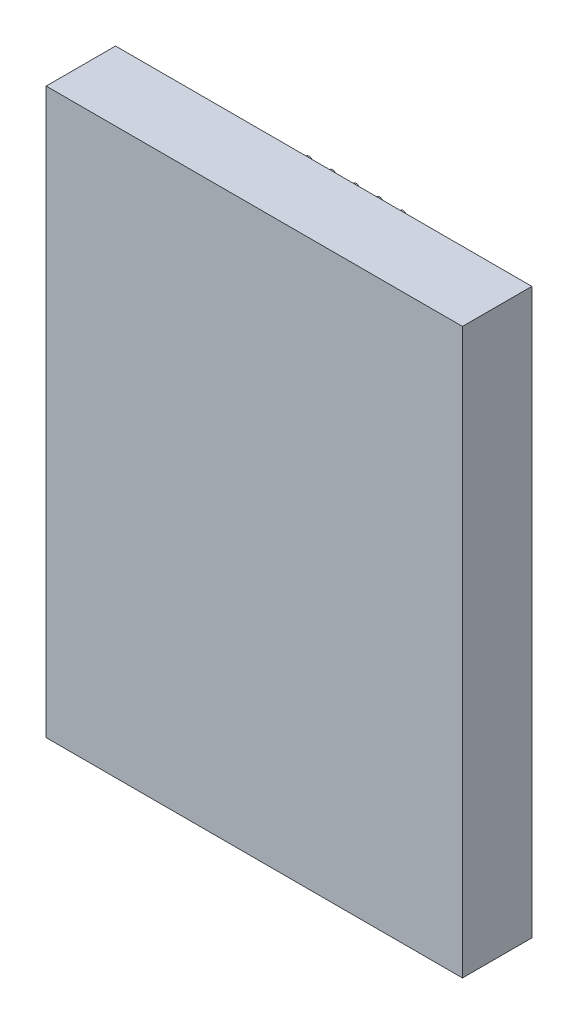
ISO-10303-21;
HEADER;
FILE_DESCRIPTION(('STEP AP214'),'2;1');
FILE_NAME('part.step','',(''),(''),'','','');
FILE_SCHEMA(('AUTOMOTIVE_DESIGN { 1 0 10303 214 1 1 1 1 }'));
ENDSEC;
DATA;
#1=APPLICATION_CONTEXT('core data for automotive mechanical design processes');
#2=APPLICATION_PROTOCOL_DEFINITION('international standard','automotive_design',2000,#1);
#3=PRODUCT_CONTEXT('',#1,'mechanical');
#4=PRODUCT('Part','Part','',(#3));
#5=PRODUCT_RELATED_PRODUCT_CATEGORY('part','',(#4));
#6=PRODUCT_DEFINITION_FORMATION('','',#4);
#7=PRODUCT_DEFINITION_CONTEXT('part definition',#1,'design');
#8=PRODUCT_DEFINITION('design','',#6,#7);
#9=PRODUCT_DEFINITION_SHAPE('','',#8);
#10=(LENGTH_UNIT() NAMED_UNIT(*) SI_UNIT(.MILLI.,.METRE.));
#11=(NAMED_UNIT(*) PLANE_ANGLE_UNIT() SI_UNIT($,.RADIAN.));
#12=(NAMED_UNIT(*) SI_UNIT($,.STERADIAN.) SOLID_ANGLE_UNIT());
#13=UNCERTAINTY_MEASURE_WITH_UNIT(LENGTH_MEASURE(1.E-05),#10,'distance_accuracy_value','');
#14=(GEOMETRIC_REPRESENTATION_CONTEXT(3) GLOBAL_UNCERTAINTY_ASSIGNED_CONTEXT((#13)) GLOBAL_UNIT_ASSIGNED_CONTEXT((#10,
#11,#12)) REPRESENTATION_CONTEXT('',''));
#15=CARTESIAN_POINT('',(0.,0.,0.));
#16=DIRECTION('',(0.,0.,1.));
#17=DIRECTION('',(1.,0.,0.));
#18=AXIS2_PLACEMENT_3D('',#15,#16,#17);
#19=CARTESIAN_POINT('',(45.,61.,15.));
#20=DIRECTION('',(-1.,0.,0.));
#21=DIRECTION('',(0.,-1.,0.));
#22=AXIS2_PLACEMENT_3D('',#19,#20,#21);
#23=PLANE('',#22);
#24=DIRECTION('',(0.,1.,0.));
#25=VECTOR('',#24,1.);
#26=CARTESIAN_POINT('',(45.,61.,0.));
#27=LINE('',#26,#25);
#28=CARTESIAN_POINT('',(45.,-61.,0.));
#29=VERTEX_POINT('',#28);
#30=CARTESIAN_POINT('',(45.,61.,0.));
#31=VERTEX_POINT('',#30);
#32=EDGE_CURVE('E96',#29,#31,#27,.T.);
#33=ORIENTED_EDGE('',*,*,#32,.T.);
#34=DIRECTION('',(0.,0.,-1.));
#35=VECTOR('',#34,1.);
#36=CARTESIAN_POINT('',(45.,61.,15.));
#37=LINE('',#36,#35);
#38=CARTESIAN_POINT('',(45.,61.,15.));
#39=VERTEX_POINT('',#38);
#40=EDGE_CURVE('E11',#39,#31,#37,.T.);
#41=ORIENTED_EDGE('',*,*,#40,.F.);
#42=DIRECTION('',(0.,1.,0.));
#43=VECTOR('',#42,1.);
#44=CARTESIAN_POINT('',(45.,61.,15.));
#45=LINE('',#44,#43);
#46=CARTESIAN_POINT('',(45.,-61.,15.));
#47=VERTEX_POINT('',#46);
#48=EDGE_CURVE('E84',#47,#39,#45,.T.);
#49=ORIENTED_EDGE('',*,*,#48,.F.);
#50=DIRECTION('',(0.,0.,-1.));
#51=VECTOR('',#50,1.);
#52=CARTESIAN_POINT('',(45.,-61.,15.));
#53=LINE('',#52,#51);
#54=EDGE_CURVE('E92',#47,#29,#53,.T.);
#55=ORIENTED_EDGE('',*,*,#54,.T.);
#56=EDGE_LOOP('',(#33,#41,#49,#55));
#57=FACE_BOUND('',#56,.T.);
#58=ADVANCED_FACE('F33',(#57),#23,.F.);
#59=CARTESIAN_POINT('',(-45.,61.,15.));
#60=DIRECTION('',(0.,-1.,0.));
#61=DIRECTION('',(0.,0.,-1.));
#62=AXIS2_PLACEMENT_3D('',#59,#60,#61);
#63=PLANE('',#62);
#64=DIRECTION('',(-1.,0.,0.));
#65=VECTOR('',#64,1.);
#66=CARTESIAN_POINT('',(-45.,61.,0.));
#67=LINE('',#66,#65);
#68=CARTESIAN_POINT('',(-45.,61.,0.));
#69=VERTEX_POINT('',#68);
#70=EDGE_CURVE('E88',#31,#69,#67,.T.);
#71=ORIENTED_EDGE('',*,*,#70,.T.);
#72=DIRECTION('',(0.,0.,-1.));
#73=VECTOR('',#72,1.);
#74=CARTESIAN_POINT('',(-45.,61.,15.));
#75=LINE('',#74,#73);
#76=CARTESIAN_POINT('',(-45.,61.,15.));
#77=VERTEX_POINT('',#76);
#78=EDGE_CURVE('E41',#77,#69,#75,.T.);
#79=ORIENTED_EDGE('',*,*,#78,.F.);
#80=DIRECTION('',(-1.,0.,0.));
#81=VECTOR('',#80,1.);
#82=CARTESIAN_POINT('',(-45.,61.,15.));
#83=LINE('',#82,#81);
#84=EDGE_CURVE('E79',#39,#77,#83,.T.);
#85=ORIENTED_EDGE('',*,*,#84,.F.);
#86=ORIENTED_EDGE('',*,*,#40,.T.);
#87=EDGE_LOOP('',(#71,#79,#85,#86));
#88=FACE_BOUND('',#87,.T.);
#89=ADVANCED_FACE('F87',(#88),#63,.F.);
#90=CARTESIAN_POINT('',(-45.,61.,15.));
#91=DIRECTION('',(1.,0.,0.));
#92=DIRECTION('',(0.,1.,0.));
#93=AXIS2_PLACEMENT_3D('',#90,#91,#92);
#94=PLANE('',#93);
#95=DIRECTION('',(0.,-1.,0.));
#96=VECTOR('',#95,1.);
#97=CARTESIAN_POINT('',(-45.,61.,0.));
#98=LINE('',#97,#96);
#99=CARTESIAN_POINT('',(-45.,-61.,0.));
#100=VERTEX_POINT('',#99);
#101=EDGE_CURVE('E66',#69,#100,#98,.T.);
#102=ORIENTED_EDGE('',*,*,#101,.T.);
#103=DIRECTION('',(0.,0.,-1.));
#104=VECTOR('',#103,1.);
#105=CARTESIAN_POINT('',(-45.,-61.,15.));
#106=LINE('',#105,#104);
#107=CARTESIAN_POINT('',(-45.,-61.,15.));
#108=VERTEX_POINT('',#107);
#109=EDGE_CURVE('E89',#108,#100,#106,.T.);
#110=ORIENTED_EDGE('',*,*,#109,.F.);
#111=DIRECTION('',(0.,-1.,0.));
#112=VECTOR('',#111,1.);
#113=CARTESIAN_POINT('',(-45.,61.,15.));
#114=LINE('',#113,#112);
#115=EDGE_CURVE('E82',#77,#108,#114,.T.);
#116=ORIENTED_EDGE('',*,*,#115,.F.);
#117=ORIENTED_EDGE('',*,*,#78,.T.);
#118=EDGE_LOOP('',(#102,#110,#116,#117));
#119=FACE_BOUND('',#118,.T.);
#120=ADVANCED_FACE('F90',(#119),#94,.F.);
#121=CARTESIAN_POINT('',(-45.,-61.,15.));
#122=DIRECTION('',(0.,1.,0.));
#123=DIRECTION('',(0.,0.,1.));
#124=AXIS2_PLACEMENT_3D('',#121,#122,#123);
#125=PLANE('',#124);
#126=DIRECTION('',(1.,0.,0.));
#127=VECTOR('',#126,1.);
#128=CARTESIAN_POINT('',(-45.,-61.,0.));
#129=LINE('',#128,#127);
#130=EDGE_CURVE('E72',#100,#29,#129,.T.);
#131=ORIENTED_EDGE('',*,*,#130,.T.);
#132=ORIENTED_EDGE('',*,*,#54,.F.);
#133=DIRECTION('',(1.,0.,0.));
#134=VECTOR('',#133,1.);
#135=CARTESIAN_POINT('',(-45.,-61.,15.));
#136=LINE('',#135,#134);
#137=EDGE_CURVE('E49',#108,#47,#136,.T.);
#138=ORIENTED_EDGE('',*,*,#137,.F.);
#139=ORIENTED_EDGE('',*,*,#109,.T.);
#140=EDGE_LOOP('',(#131,#132,#138,#139));
#141=FACE_BOUND('',#140,.T.);
#142=ADVANCED_FACE('F104',(#141),#125,.F.);
#143=CARTESIAN_POINT('',(0.,0.,15.));
#144=DIRECTION('',(0.,0.,1.));
#145=DIRECTION('',(1.,0.,0.));
#146=AXIS2_PLACEMENT_3D('',#143,#144,#145);
#147=PLANE('',#146);
#148=ORIENTED_EDGE('',*,*,#48,.T.);
#149=ORIENTED_EDGE('',*,*,#84,.T.);
#150=ORIENTED_EDGE('',*,*,#115,.T.);
#151=ORIENTED_EDGE('',*,*,#137,.T.);
#152=EDGE_LOOP('',(#148,#149,#150,#151));
#153=FACE_BOUND('',#152,.T.);
#154=ADVANCED_FACE('F80',(#153),#147,.T.);
#155=CARTESIAN_POINT('',(0.,0.,0.));
#156=DIRECTION('',(0.,0.,1.));
#157=DIRECTION('',(1.,0.,0.));
#158=AXIS2_PLACEMENT_3D('',#155,#156,#157);
#159=PLANE('',#158);
#160=CARTESIAN_POINT('',(-10.16,53.4999999999999,0.));
#161=DIRECTION('',(0.,0.,1.));
#162=DIRECTION('',(1.,0.,0.));
#163=AXIS2_PLACEMENT_3D('',#160,#161,#162);
#164=CIRCLE('',#163,0.800000000000005);
#165=CARTESIAN_POINT('',(-9.35999999999999,53.4999999999999,0.));
#166=VERTEX_POINT('',#165);
#167=EDGE_CURVE('E164',#166,#166,#164,.T.);
#168=ORIENTED_EDGE('',*,*,#167,.T.);
#169=EDGE_LOOP('',(#168));
#170=FACE_BOUND('',#169,.T.);
#171=CARTESIAN_POINT('',(-10.16,-53.5000000000001,0.));
#172=DIRECTION('',(0.,0.,1.));
#173=DIRECTION('',(1.,0.,0.));
#174=AXIS2_PLACEMENT_3D('',#171,#172,#173);
#175=CIRCLE('',#174,0.800000000000003);
#176=CARTESIAN_POINT('',(-9.35999999999999,-53.5000000000001,0.));
#177=VERTEX_POINT('',#176);
#178=EDGE_CURVE('E158',#177,#177,#175,.T.);
#179=ORIENTED_EDGE('',*,*,#178,.T.);
#180=EDGE_LOOP('',(#179));
#181=FACE_BOUND('',#180,.T.);
#182=CARTESIAN_POINT('',(-5.07999999999999,53.4999999999999,0.));
#183=DIRECTION('',(0.,0.,1.));
#184=DIRECTION('',(1.,0.,0.));
#185=AXIS2_PLACEMENT_3D('',#182,#183,#184);
#186=CIRCLE('',#185,0.800000000000005);
#187=CARTESIAN_POINT('',(-4.27999999999999,53.4999999999999,0.));
#188=VERTEX_POINT('',#187);
#189=EDGE_CURVE('E152',#188,#188,#186,.T.);
#190=ORIENTED_EDGE('',*,*,#189,.T.);
#191=EDGE_LOOP('',(#190));
#192=FACE_BOUND('',#191,.T.);
#193=CARTESIAN_POINT('',(-5.07999999999999,-53.5000000000001,0.));
#194=DIRECTION('',(0.,0.,1.));
#195=DIRECTION('',(1.,0.,0.));
#196=AXIS2_PLACEMENT_3D('',#193,#194,#195);
#197=CIRCLE('',#196,0.800000000000003);
#198=CARTESIAN_POINT('',(-4.27999999999999,-53.5000000000001,0.));
#199=VERTEX_POINT('',#198);
#200=EDGE_CURVE('E146',#199,#199,#197,.T.);
#201=ORIENTED_EDGE('',*,*,#200,.T.);
#202=EDGE_LOOP('',(#201));
#203=FACE_BOUND('',#202,.T.);
#204=CARTESIAN_POINT('',(0.,53.4999999999999,0.));
#205=DIRECTION('',(0.,0.,1.));
#206=DIRECTION('',(1.,0.,0.));
#207=AXIS2_PLACEMENT_3D('',#204,#205,#206);
#208=CIRCLE('',#207,0.800000000000005);
#209=CARTESIAN_POINT('',(0.800000000000013,53.4999999999999,0.));
#210=VERTEX_POINT('',#209);
#211=EDGE_CURVE('E140',#210,#210,#208,.T.);
#212=ORIENTED_EDGE('',*,*,#211,.T.);
#213=EDGE_LOOP('',(#212));
#214=FACE_BOUND('',#213,.T.);
#215=CARTESIAN_POINT('',(0.,-53.5000000000001,0.));
#216=DIRECTION('',(0.,0.,1.));
#217=DIRECTION('',(1.,0.,0.));
#218=AXIS2_PLACEMENT_3D('',#215,#216,#217);
#219=CIRCLE('',#218,0.800000000000003);
#220=CARTESIAN_POINT('',(0.800000000000012,-53.5000000000001,0.));
#221=VERTEX_POINT('',#220);
#222=EDGE_CURVE('E134',#221,#221,#219,.T.);
#223=ORIENTED_EDGE('',*,*,#222,.T.);
#224=EDGE_LOOP('',(#223));
#225=FACE_BOUND('',#224,.T.);
#226=CARTESIAN_POINT('',(5.08000000000001,53.5,0.));
#227=DIRECTION('',(0.,0.,1.));
#228=DIRECTION('',(1.,0.,0.));
#229=AXIS2_PLACEMENT_3D('',#226,#227,#228);
#230=CIRCLE('',#229,0.800000000000005);
#231=CARTESIAN_POINT('',(5.88000000000001,53.5,0.));
#232=VERTEX_POINT('',#231);
#233=EDGE_CURVE('E128',#232,#232,#230,.T.);
#234=ORIENTED_EDGE('',*,*,#233,.T.);
#235=EDGE_LOOP('',(#234));
#236=FACE_BOUND('',#235,.T.);
#237=CARTESIAN_POINT('',(5.08000000000001,-53.5,0.));
#238=DIRECTION('',(0.,0.,1.));
#239=DIRECTION('',(1.,0.,0.));
#240=AXIS2_PLACEMENT_3D('',#237,#238,#239);
#241=CIRCLE('',#240,0.800000000000003);
#242=CARTESIAN_POINT('',(5.88000000000001,-53.5,0.));
#243=VERTEX_POINT('',#242);
#244=EDGE_CURVE('E122',#243,#243,#241,.T.);
#245=ORIENTED_EDGE('',*,*,#244,.T.);
#246=EDGE_LOOP('',(#245));
#247=FACE_BOUND('',#246,.T.);
#248=CARTESIAN_POINT('',(10.16,53.5,0.));
#249=DIRECTION('',(0.,0.,1.));
#250=DIRECTION('',(1.,0.,0.));
#251=AXIS2_PLACEMENT_3D('',#248,#249,#250);
#252=CIRCLE('',#251,0.800000000000005);
#253=CARTESIAN_POINT('',(10.96,53.5,0.));
#254=VERTEX_POINT('',#253);
#255=EDGE_CURVE('E116',#254,#254,#252,.T.);
#256=ORIENTED_EDGE('',*,*,#255,.T.);
#257=EDGE_LOOP('',(#256));
#258=FACE_BOUND('',#257,.T.);
#259=CARTESIAN_POINT('',(10.16,-53.5,0.));
#260=DIRECTION('',(0.,0.,1.));
#261=DIRECTION('',(1.,0.,0.));
#262=AXIS2_PLACEMENT_3D('',#259,#260,#261);
#263=CIRCLE('',#262,0.800000000000003);
#264=CARTESIAN_POINT('',(10.96,-53.5,0.));
#265=VERTEX_POINT('',#264);
#266=EDGE_CURVE('E110',#265,#265,#263,.T.);
#267=ORIENTED_EDGE('',*,*,#266,.T.);
#268=EDGE_LOOP('',(#267));
#269=FACE_BOUND('',#268,.T.);
#270=ORIENTED_EDGE('',*,*,#32,.F.);
#271=ORIENTED_EDGE('',*,*,#130,.F.);
#272=ORIENTED_EDGE('',*,*,#101,.F.);
#273=ORIENTED_EDGE('',*,*,#70,.F.);
#274=EDGE_LOOP('',(#270,#271,#272,#273));
#275=FACE_BOUND('',#274,.T.);
#276=ADVANCED_FACE('F107',(#170,#181,#192,#203,#214,#225,#236,#247,#258,#269,#275),#159,.F.);
#277=CARTESIAN_POINT('',(10.16,-53.5,-7.));
#278=DIRECTION('',(0.,0.,1.));
#279=DIRECTION('',(1.,0.,0.));
#280=AXIS2_PLACEMENT_3D('',#277,#278,#279);
#281=CYLINDRICAL_SURFACE('',#280,0.800000000000003);
#282=CARTESIAN_POINT('',(10.16,-53.5,-7.));
#283=DIRECTION('',(0.,0.,1.));
#284=DIRECTION('',(1.,0.,0.));
#285=AXIS2_PLACEMENT_3D('',#282,#283,#284);
#286=CIRCLE('',#285,0.800000000000003);
#287=CARTESIAN_POINT('',(10.96,-53.5,-7.));
#288=VERTEX_POINT('',#287);
#289=EDGE_CURVE('E99',#288,#288,#286,.T.);
#290=ORIENTED_EDGE('',*,*,#289,.T.);
#291=EDGE_LOOP('',(#290));
#292=FACE_BOUND('',#291,.T.);
#293=ORIENTED_EDGE('',*,*,#266,.F.);
#294=EDGE_LOOP('',(#293));
#295=FACE_BOUND('',#294,.T.);
#296=ADVANCED_FACE('F194',(#292,#295),#281,.T.);
#297=CARTESIAN_POINT('',(10.16,-53.5,-7.));
#298=DIRECTION('',(0.,0.,1.));
#299=DIRECTION('',(1.,0.,0.));
#300=AXIS2_PLACEMENT_3D('',#297,#298,#299);
#301=PLANE('',#300);
#302=ORIENTED_EDGE('',*,*,#289,.F.);
#303=EDGE_LOOP('',(#302));
#304=FACE_BOUND('',#303,.T.);
#305=ADVANCED_FACE('F200',(#304),#301,.F.);
#306=CARTESIAN_POINT('',(10.16,53.5,-7.));
#307=DIRECTION('',(0.,0.,1.));
#308=DIRECTION('',(1.,0.,0.));
#309=AXIS2_PLACEMENT_3D('',#306,#307,#308);
#310=CYLINDRICAL_SURFACE('',#309,0.800000000000005);
#311=CARTESIAN_POINT('',(10.16,53.5,-7.));
#312=DIRECTION('',(0.,0.,1.));
#313=DIRECTION('',(1.,0.,0.));
#314=AXIS2_PLACEMENT_3D('',#311,#312,#313);
#315=CIRCLE('',#314,0.800000000000005);
#316=CARTESIAN_POINT('',(10.96,53.5,-7.));
#317=VERTEX_POINT('',#316);
#318=EDGE_CURVE('E113',#317,#317,#315,.T.);
#319=ORIENTED_EDGE('',*,*,#318,.T.);
#320=EDGE_LOOP('',(#319));
#321=FACE_BOUND('',#320,.T.);
#322=ORIENTED_EDGE('',*,*,#255,.F.);
#323=EDGE_LOOP('',(#322));
#324=FACE_BOUND('',#323,.T.);
#325=ADVANCED_FACE('F204',(#321,#324),#310,.T.);
#326=CARTESIAN_POINT('',(10.16,53.5,-7.));
#327=DIRECTION('',(0.,0.,1.));
#328=DIRECTION('',(1.,0.,0.));
#329=AXIS2_PLACEMENT_3D('',#326,#327,#328);
#330=PLANE('',#329);
#331=ORIENTED_EDGE('',*,*,#318,.F.);
#332=EDGE_LOOP('',(#331));
#333=FACE_BOUND('',#332,.T.);
#334=ADVANCED_FACE('F208',(#333),#330,.F.);
#335=CARTESIAN_POINT('',(5.08000000000001,-53.5,-7.));
#336=DIRECTION('',(0.,0.,1.));
#337=DIRECTION('',(1.,0.,0.));
#338=AXIS2_PLACEMENT_3D('',#335,#336,#337);
#339=CYLINDRICAL_SURFACE('',#338,0.800000000000003);
#340=CARTESIAN_POINT('',(5.08000000000001,-53.5,-7.));
#341=DIRECTION('',(0.,0.,1.));
#342=DIRECTION('',(1.,0.,0.));
#343=AXIS2_PLACEMENT_3D('',#340,#341,#342);
#344=CIRCLE('',#343,0.800000000000003);
#345=CARTESIAN_POINT('',(5.88000000000001,-53.5,-7.));
#346=VERTEX_POINT('',#345);
#347=EDGE_CURVE('E119',#346,#346,#344,.T.);
#348=ORIENTED_EDGE('',*,*,#347,.T.);
#349=EDGE_LOOP('',(#348));
#350=FACE_BOUND('',#349,.T.);
#351=ORIENTED_EDGE('',*,*,#244,.F.);
#352=EDGE_LOOP('',(#351));
#353=FACE_BOUND('',#352,.T.);
#354=ADVANCED_FACE('F212',(#350,#353),#339,.T.);
#355=CARTESIAN_POINT('',(5.08000000000001,-53.5,-7.));
#356=DIRECTION('',(0.,0.,1.));
#357=DIRECTION('',(1.,0.,0.));
#358=AXIS2_PLACEMENT_3D('',#355,#356,#357);
#359=PLANE('',#358);
#360=ORIENTED_EDGE('',*,*,#347,.F.);
#361=EDGE_LOOP('',(#360));
#362=FACE_BOUND('',#361,.T.);
#363=ADVANCED_FACE('F216',(#362),#359,.F.);
#364=CARTESIAN_POINT('',(5.08000000000001,53.5,-7.));
#365=DIRECTION('',(0.,0.,1.));
#366=DIRECTION('',(1.,0.,0.));
#367=AXIS2_PLACEMENT_3D('',#364,#365,#366);
#368=CYLINDRICAL_SURFACE('',#367,0.800000000000005);
#369=CARTESIAN_POINT('',(5.08000000000001,53.5,-7.));
#370=DIRECTION('',(0.,0.,1.));
#371=DIRECTION('',(1.,0.,0.));
#372=AXIS2_PLACEMENT_3D('',#369,#370,#371);
#373=CIRCLE('',#372,0.800000000000005);
#374=CARTESIAN_POINT('',(5.88000000000001,53.5,-7.));
#375=VERTEX_POINT('',#374);
#376=EDGE_CURVE('E125',#375,#375,#373,.T.);
#377=ORIENTED_EDGE('',*,*,#376,.T.);
#378=EDGE_LOOP('',(#377));
#379=FACE_BOUND('',#378,.T.);
#380=ORIENTED_EDGE('',*,*,#233,.F.);
#381=EDGE_LOOP('',(#380));
#382=FACE_BOUND('',#381,.T.);
#383=ADVANCED_FACE('F220',(#379,#382),#368,.T.);
#384=CARTESIAN_POINT('',(5.08000000000001,53.5,-7.));
#385=DIRECTION('',(0.,0.,1.));
#386=DIRECTION('',(1.,0.,0.));
#387=AXIS2_PLACEMENT_3D('',#384,#385,#386);
#388=PLANE('',#387);
#389=ORIENTED_EDGE('',*,*,#376,.F.);
#390=EDGE_LOOP('',(#389));
#391=FACE_BOUND('',#390,.T.);
#392=ADVANCED_FACE('F224',(#391),#388,.F.);
#393=CARTESIAN_POINT('',(0.,-53.5000000000001,-7.));
#394=DIRECTION('',(0.,0.,1.));
#395=DIRECTION('',(1.,0.,0.));
#396=AXIS2_PLACEMENT_3D('',#393,#394,#395);
#397=CYLINDRICAL_SURFACE('',#396,0.800000000000003);
#398=CARTESIAN_POINT('',(0.,-53.5000000000001,-7.));
#399=DIRECTION('',(0.,0.,1.));
#400=DIRECTION('',(1.,0.,0.));
#401=AXIS2_PLACEMENT_3D('',#398,#399,#400);
#402=CIRCLE('',#401,0.800000000000003);
#403=CARTESIAN_POINT('',(0.800000000000012,-53.5000000000001,-7.));
#404=VERTEX_POINT('',#403);
#405=EDGE_CURVE('E131',#404,#404,#402,.T.);
#406=ORIENTED_EDGE('',*,*,#405,.T.);
#407=EDGE_LOOP('',(#406));
#408=FACE_BOUND('',#407,.T.);
#409=ORIENTED_EDGE('',*,*,#222,.F.);
#410=EDGE_LOOP('',(#409));
#411=FACE_BOUND('',#410,.T.);
#412=ADVANCED_FACE('F228',(#408,#411),#397,.T.);
#413=CARTESIAN_POINT('',(0.,-53.5000000000001,-7.));
#414=DIRECTION('',(0.,0.,1.));
#415=DIRECTION('',(1.,0.,0.));
#416=AXIS2_PLACEMENT_3D('',#413,#414,#415);
#417=PLANE('',#416);
#418=ORIENTED_EDGE('',*,*,#405,.F.);
#419=EDGE_LOOP('',(#418));
#420=FACE_BOUND('',#419,.T.);
#421=ADVANCED_FACE('F232',(#420),#417,.F.);
#422=CARTESIAN_POINT('',(0.,53.4999999999999,-7.));
#423=DIRECTION('',(0.,0.,1.));
#424=DIRECTION('',(1.,0.,0.));
#425=AXIS2_PLACEMENT_3D('',#422,#423,#424);
#426=CYLINDRICAL_SURFACE('',#425,0.800000000000005);
#427=CARTESIAN_POINT('',(0.,53.4999999999999,-7.));
#428=DIRECTION('',(0.,0.,1.));
#429=DIRECTION('',(1.,0.,0.));
#430=AXIS2_PLACEMENT_3D('',#427,#428,#429);
#431=CIRCLE('',#430,0.800000000000005);
#432=CARTESIAN_POINT('',(0.800000000000013,53.4999999999999,-7.));
#433=VERTEX_POINT('',#432);
#434=EDGE_CURVE('E137',#433,#433,#431,.T.);
#435=ORIENTED_EDGE('',*,*,#434,.T.);
#436=EDGE_LOOP('',(#435));
#437=FACE_BOUND('',#436,.T.);
#438=ORIENTED_EDGE('',*,*,#211,.F.);
#439=EDGE_LOOP('',(#438));
#440=FACE_BOUND('',#439,.T.);
#441=ADVANCED_FACE('F236',(#437,#440),#426,.T.);
#442=CARTESIAN_POINT('',(0.,53.4999999999999,-7.));
#443=DIRECTION('',(0.,0.,1.));
#444=DIRECTION('',(1.,0.,0.));
#445=AXIS2_PLACEMENT_3D('',#442,#443,#444);
#446=PLANE('',#445);
#447=ORIENTED_EDGE('',*,*,#434,.F.);
#448=EDGE_LOOP('',(#447));
#449=FACE_BOUND('',#448,.T.);
#450=ADVANCED_FACE('F240',(#449),#446,.F.);
#451=CARTESIAN_POINT('',(-5.07999999999999,-53.5000000000001,-7.));
#452=DIRECTION('',(0.,0.,1.));
#453=DIRECTION('',(1.,0.,0.));
#454=AXIS2_PLACEMENT_3D('',#451,#452,#453);
#455=CYLINDRICAL_SURFACE('',#454,0.800000000000003);
#456=CARTESIAN_POINT('',(-5.07999999999999,-53.5000000000001,-7.));
#457=DIRECTION('',(0.,0.,1.));
#458=DIRECTION('',(1.,0.,0.));
#459=AXIS2_PLACEMENT_3D('',#456,#457,#458);
#460=CIRCLE('',#459,0.800000000000003);
#461=CARTESIAN_POINT('',(-4.27999999999999,-53.5000000000001,-7.));
#462=VERTEX_POINT('',#461);
#463=EDGE_CURVE('E143',#462,#462,#460,.T.);
#464=ORIENTED_EDGE('',*,*,#463,.T.);
#465=EDGE_LOOP('',(#464));
#466=FACE_BOUND('',#465,.T.);
#467=ORIENTED_EDGE('',*,*,#200,.F.);
#468=EDGE_LOOP('',(#467));
#469=FACE_BOUND('',#468,.T.);
#470=ADVANCED_FACE('F244',(#466,#469),#455,.T.);
#471=CARTESIAN_POINT('',(-5.07999999999999,-53.5000000000001,-7.));
#472=DIRECTION('',(0.,0.,1.));
#473=DIRECTION('',(1.,0.,0.));
#474=AXIS2_PLACEMENT_3D('',#471,#472,#473);
#475=PLANE('',#474);
#476=ORIENTED_EDGE('',*,*,#463,.F.);
#477=EDGE_LOOP('',(#476));
#478=FACE_BOUND('',#477,.T.);
#479=ADVANCED_FACE('F248',(#478),#475,.F.);
#480=CARTESIAN_POINT('',(-5.07999999999999,53.4999999999999,-7.));
#481=DIRECTION('',(0.,0.,1.));
#482=DIRECTION('',(1.,0.,0.));
#483=AXIS2_PLACEMENT_3D('',#480,#481,#482);
#484=CYLINDRICAL_SURFACE('',#483,0.800000000000005);
#485=CARTESIAN_POINT('',(-5.07999999999999,53.4999999999999,-7.));
#486=DIRECTION('',(0.,0.,1.));
#487=DIRECTION('',(1.,0.,0.));
#488=AXIS2_PLACEMENT_3D('',#485,#486,#487);
#489=CIRCLE('',#488,0.800000000000005);
#490=CARTESIAN_POINT('',(-4.27999999999999,53.4999999999999,-7.));
#491=VERTEX_POINT('',#490);
#492=EDGE_CURVE('E149',#491,#491,#489,.T.);
#493=ORIENTED_EDGE('',*,*,#492,.T.);
#494=EDGE_LOOP('',(#493));
#495=FACE_BOUND('',#494,.T.);
#496=ORIENTED_EDGE('',*,*,#189,.F.);
#497=EDGE_LOOP('',(#496));
#498=FACE_BOUND('',#497,.T.);
#499=ADVANCED_FACE('F252',(#495,#498),#484,.T.);
#500=CARTESIAN_POINT('',(-5.07999999999999,53.4999999999999,-7.));
#501=DIRECTION('',(0.,0.,1.));
#502=DIRECTION('',(1.,0.,0.));
#503=AXIS2_PLACEMENT_3D('',#500,#501,#502);
#504=PLANE('',#503);
#505=ORIENTED_EDGE('',*,*,#492,.F.);
#506=EDGE_LOOP('',(#505));
#507=FACE_BOUND('',#506,.T.);
#508=ADVANCED_FACE('F256',(#507),#504,.F.);
#509=CARTESIAN_POINT('',(-10.16,-53.5000000000001,-7.));
#510=DIRECTION('',(0.,0.,1.));
#511=DIRECTION('',(1.,0.,0.));
#512=AXIS2_PLACEMENT_3D('',#509,#510,#511);
#513=CYLINDRICAL_SURFACE('',#512,0.800000000000003);
#514=CARTESIAN_POINT('',(-10.16,-53.5000000000001,-7.));
#515=DIRECTION('',(0.,0.,1.));
#516=DIRECTION('',(1.,0.,0.));
#517=AXIS2_PLACEMENT_3D('',#514,#515,#516);
#518=CIRCLE('',#517,0.800000000000003);
#519=CARTESIAN_POINT('',(-9.35999999999999,-53.5000000000001,-7.));
#520=VERTEX_POINT('',#519);
#521=EDGE_CURVE('E155',#520,#520,#518,.T.);
#522=ORIENTED_EDGE('',*,*,#521,.T.);
#523=EDGE_LOOP('',(#522));
#524=FACE_BOUND('',#523,.T.);
#525=ORIENTED_EDGE('',*,*,#178,.F.);
#526=EDGE_LOOP('',(#525));
#527=FACE_BOUND('',#526,.T.);
#528=ADVANCED_FACE('F260',(#524,#527),#513,.T.);
#529=CARTESIAN_POINT('',(-10.16,-53.5000000000001,-7.));
#530=DIRECTION('',(0.,0.,1.));
#531=DIRECTION('',(1.,0.,0.));
#532=AXIS2_PLACEMENT_3D('',#529,#530,#531);
#533=PLANE('',#532);
#534=ORIENTED_EDGE('',*,*,#521,.F.);
#535=EDGE_LOOP('',(#534));
#536=FACE_BOUND('',#535,.T.);
#537=ADVANCED_FACE('F179',(#536),#533,.F.);
#538=CARTESIAN_POINT('',(-10.16,53.4999999999999,-7.));
#539=DIRECTION('',(0.,0.,1.));
#540=DIRECTION('',(1.,0.,0.));
#541=AXIS2_PLACEMENT_3D('',#538,#539,#540);
#542=CYLINDRICAL_SURFACE('',#541,0.800000000000005);
#543=CARTESIAN_POINT('',(-10.16,53.4999999999999,-7.));
#544=DIRECTION('',(0.,0.,1.));
#545=DIRECTION('',(1.,0.,0.));
#546=AXIS2_PLACEMENT_3D('',#543,#544,#545);
#547=CIRCLE('',#546,0.800000000000005);
#548=CARTESIAN_POINT('',(-9.35999999999999,53.4999999999999,-7.));
#549=VERTEX_POINT('',#548);
#550=EDGE_CURVE('E161',#549,#549,#547,.T.);
#551=ORIENTED_EDGE('',*,*,#550,.T.);
#552=EDGE_LOOP('',(#551));
#553=FACE_BOUND('',#552,.T.);
#554=ORIENTED_EDGE('',*,*,#167,.F.);
#555=EDGE_LOOP('',(#554));
#556=FACE_BOUND('',#555,.T.);
#557=ADVANCED_FACE('F170',(#553,#556),#542,.T.);
#558=CARTESIAN_POINT('',(-10.16,53.4999999999999,-7.));
#559=DIRECTION('',(0.,0.,1.));
#560=DIRECTION('',(1.,0.,0.));
#561=AXIS2_PLACEMENT_3D('',#558,#559,#560);
#562=PLANE('',#561);
#563=ORIENTED_EDGE('',*,*,#550,.F.);
#564=EDGE_LOOP('',(#563));
#565=FACE_BOUND('',#564,.T.);
#566=ADVANCED_FACE('F173',(#565),#562,.F.);
#567=CLOSED_SHELL('',(#58,#89,#120,#142,#154,#276,#296,#305,#325,#334,#354,#363,#383,#392,#412,
#421,#441,#450,#470,#479,#499,#508,#528,#537,#557,#566));
#568=MANIFOLD_SOLID_BREP('B2',#567);
#569=ADVANCED_BREP_SHAPE_REPRESENTATION('',(#18,#568),#14);
#570=SHAPE_DEFINITION_REPRESENTATION(#9,#569);
ENDSEC;
END-ISO-10303-21;
